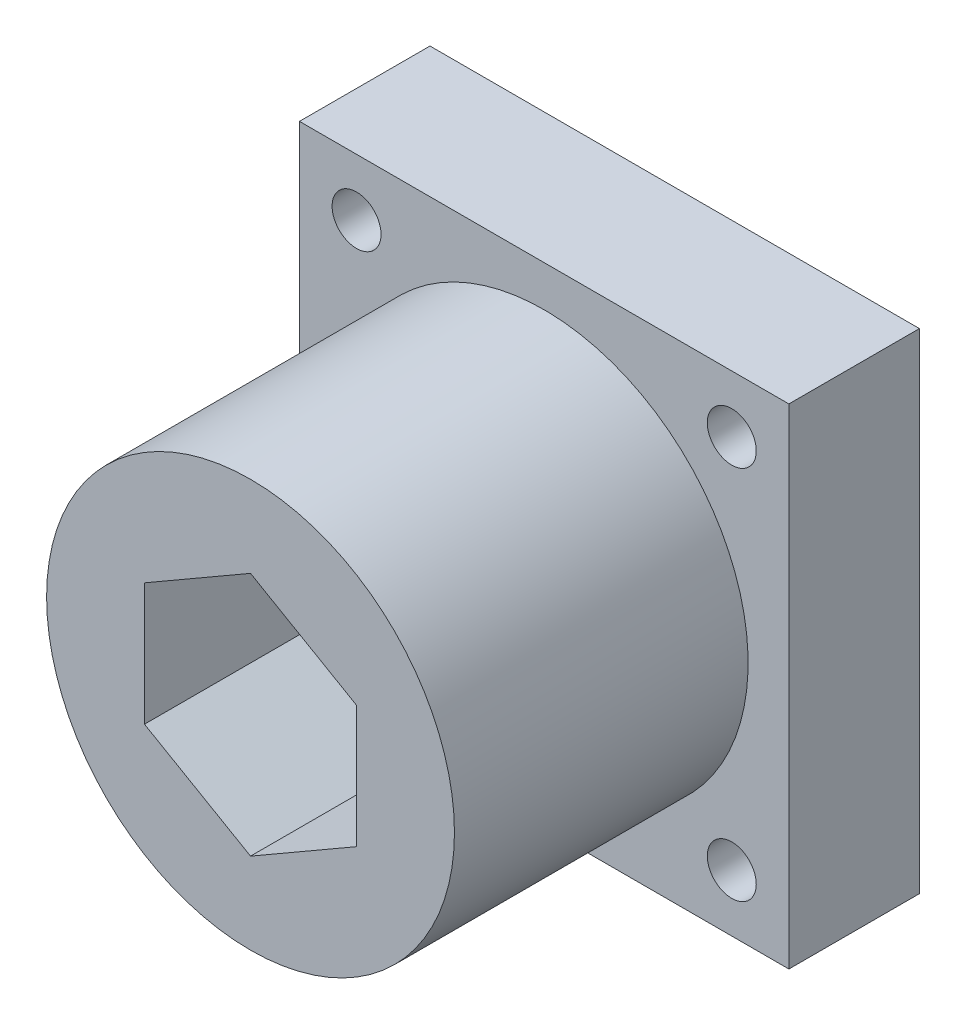
ISO-10303-21;
HEADER;
FILE_DESCRIPTION(('STEP AP214'),'2;1');
FILE_NAME('part.step','',(''),(''),'','','');
FILE_SCHEMA(('AUTOMOTIVE_DESIGN { 1 0 10303 214 1 1 1 1 }'));
ENDSEC;
DATA;
#1=APPLICATION_CONTEXT('core data for automotive mechanical design processes');
#2=APPLICATION_PROTOCOL_DEFINITION('international standard','automotive_design',2000,#1);
#3=PRODUCT_CONTEXT('',#1,'mechanical');
#4=PRODUCT('Part','Part','',(#3));
#5=PRODUCT_RELATED_PRODUCT_CATEGORY('part','',(#4));
#6=PRODUCT_DEFINITION_FORMATION('','',#4);
#7=PRODUCT_DEFINITION_CONTEXT('part definition',#1,'design');
#8=PRODUCT_DEFINITION('design','',#6,#7);
#9=PRODUCT_DEFINITION_SHAPE('','',#8);
#10=(LENGTH_UNIT() NAMED_UNIT(*) SI_UNIT(.MILLI.,.METRE.));
#11=(NAMED_UNIT(*) PLANE_ANGLE_UNIT() SI_UNIT($,.RADIAN.));
#12=(NAMED_UNIT(*) SI_UNIT($,.STERADIAN.) SOLID_ANGLE_UNIT());
#13=UNCERTAINTY_MEASURE_WITH_UNIT(LENGTH_MEASURE(1.E-05),#10,'distance_accuracy_value','');
#14=(GEOMETRIC_REPRESENTATION_CONTEXT(3) GLOBAL_UNCERTAINTY_ASSIGNED_CONTEXT((#13)) GLOBAL_UNIT_ASSIGNED_CONTEXT((#10,
#11,#12)) REPRESENTATION_CONTEXT('',''));
#15=CARTESIAN_POINT('',(0.,0.,0.));
#16=DIRECTION('',(0.,0.,1.));
#17=DIRECTION('',(1.,0.,0.));
#18=AXIS2_PLACEMENT_3D('',#15,#16,#17);
#19=CARTESIAN_POINT('',(0.,0.,8.));
#20=DIRECTION('',(0.,0.,-1.));
#21=DIRECTION('',(-1.,0.,0.));
#22=AXIS2_PLACEMENT_3D('',#19,#20,#21);
#23=PLANE('',#22);
#24=CARTESIAN_POINT('',(26.5,26.5,8.));
#25=DIRECTION('',(0.,0.,1.));
#26=DIRECTION('',(1.,0.,0.));
#27=AXIS2_PLACEMENT_3D('',#24,#25,#26);
#28=CIRCLE('',#27,1.5);
#29=CARTESIAN_POINT('',(28.,26.5,8.));
#30=VERTEX_POINT('',#29);
#31=EDGE_CURVE('E163',#30,#30,#28,.T.);
#32=ORIENTED_EDGE('',*,*,#31,.F.);
#33=EDGE_LOOP('',(#32));
#34=FACE_BOUND('',#33,.T.);
#35=CARTESIAN_POINT('',(26.5,3.5,8.));
#36=DIRECTION('',(0.,0.,1.));
#37=DIRECTION('',(1.,0.,0.));
#38=AXIS2_PLACEMENT_3D('',#35,#36,#37);
#39=CIRCLE('',#38,1.5);
#40=CARTESIAN_POINT('',(28.,3.5,8.));
#41=VERTEX_POINT('',#40);
#42=EDGE_CURVE('E169',#41,#41,#39,.T.);
#43=ORIENTED_EDGE('',*,*,#42,.F.);
#44=EDGE_LOOP('',(#43));
#45=FACE_BOUND('',#44,.T.);
#46=CARTESIAN_POINT('',(3.49999999999999,3.5,8.));
#47=DIRECTION('',(0.,0.,1.));
#48=DIRECTION('',(1.,0.,0.));
#49=AXIS2_PLACEMENT_3D('',#46,#47,#48);
#50=CIRCLE('',#49,1.5);
#51=CARTESIAN_POINT('',(4.99999999999999,3.5,8.));
#52=VERTEX_POINT('',#51);
#53=EDGE_CURVE('E158',#52,#52,#50,.T.);
#54=ORIENTED_EDGE('',*,*,#53,.F.);
#55=EDGE_LOOP('',(#54));
#56=FACE_BOUND('',#55,.T.);
#57=CARTESIAN_POINT('',(3.49999999999999,26.5,8.));
#58=DIRECTION('',(0.,0.,1.));
#59=DIRECTION('',(1.,0.,0.));
#60=AXIS2_PLACEMENT_3D('',#57,#58,#59);
#61=CIRCLE('',#60,1.5);
#62=CARTESIAN_POINT('',(4.99999999999999,26.5,8.));
#63=VERTEX_POINT('',#62);
#64=EDGE_CURVE('E162',#63,#63,#61,.T.);
#65=ORIENTED_EDGE('',*,*,#64,.F.);
#66=EDGE_LOOP('',(#65));
#67=FACE_BOUND('',#66,.T.);
#68=DIRECTION('',(0.,-1.,0.));
#69=VECTOR('',#68,1.);
#70=CARTESIAN_POINT('',(0.,0.,8.));
#71=LINE('',#70,#69);
#72=CARTESIAN_POINT('',(0.,30.,8.));
#73=VERTEX_POINT('',#72);
#74=CARTESIAN_POINT('',(0.,0.,8.));
#75=VERTEX_POINT('',#74);
#76=EDGE_CURVE('E211',#73,#75,#71,.T.);
#77=ORIENTED_EDGE('',*,*,#76,.T.);
#78=DIRECTION('',(1.,0.,0.));
#79=VECTOR('',#78,1.);
#80=CARTESIAN_POINT('',(0.,0.,8.));
#81=LINE('',#80,#79);
#82=CARTESIAN_POINT('',(30.,0.,8.));
#83=VERTEX_POINT('',#82);
#84=EDGE_CURVE('E86',#75,#83,#81,.T.);
#85=ORIENTED_EDGE('',*,*,#84,.T.);
#86=DIRECTION('',(0.,1.,0.));
#87=VECTOR('',#86,1.);
#88=CARTESIAN_POINT('',(30.,0.,8.));
#89=LINE('',#88,#87);
#90=CARTESIAN_POINT('',(30.,30.,8.));
#91=VERTEX_POINT('',#90);
#92=EDGE_CURVE('E214',#83,#91,#89,.T.);
#93=ORIENTED_EDGE('',*,*,#92,.T.);
#94=DIRECTION('',(-1.,0.,0.));
#95=VECTOR('',#94,1.);
#96=CARTESIAN_POINT('',(0.,30.,8.));
#97=LINE('',#96,#95);
#98=EDGE_CURVE('E57',#91,#73,#97,.T.);
#99=ORIENTED_EDGE('',*,*,#98,.T.);
#100=EDGE_LOOP('',(#77,#85,#93,#99));
#101=FACE_BOUND('',#100,.T.);
#102=CARTESIAN_POINT('',(15.,15.,8.));
#103=DIRECTION('',(0.,0.,-1.));
#104=DIRECTION('',(-1.,0.,0.));
#105=AXIS2_PLACEMENT_3D('',#102,#103,#104);
#106=CIRCLE('',#105,12.5);
#107=CARTESIAN_POINT('',(2.5,15.,8.));
#108=VERTEX_POINT('',#107);
#109=EDGE_CURVE('E11',#108,#108,#106,.F.);
#110=ORIENTED_EDGE('',*,*,#109,.F.);
#111=EDGE_LOOP('',(#110));
#112=FACE_BOUND('',#111,.T.);
#113=ADVANCED_FACE('F33',(#34,#45,#56,#67,#101,#112),#23,.F.);
#114=CARTESIAN_POINT('',(0.,0.,8.));
#115=DIRECTION('',(1.,0.,0.));
#116=DIRECTION('',(0.,1.,0.));
#117=AXIS2_PLACEMENT_3D('',#114,#115,#116);
#118=PLANE('',#117);
#119=DIRECTION('',(0.,-1.,0.));
#120=VECTOR('',#119,1.);
#121=CARTESIAN_POINT('',(0.,0.,0.));
#122=LINE('',#121,#120);
#123=CARTESIAN_POINT('',(0.,30.,0.));
#124=VERTEX_POINT('',#123);
#125=CARTESIAN_POINT('',(0.,0.,0.));
#126=VERTEX_POINT('',#125);
#127=EDGE_CURVE('E131',#124,#126,#122,.T.);
#128=ORIENTED_EDGE('',*,*,#127,.T.);
#129=DIRECTION('',(0.,0.,-1.));
#130=VECTOR('',#129,1.);
#131=CARTESIAN_POINT('',(0.,0.,8.));
#132=LINE('',#131,#130);
#133=EDGE_CURVE('E41',#75,#126,#132,.T.);
#134=ORIENTED_EDGE('',*,*,#133,.F.);
#135=ORIENTED_EDGE('',*,*,#76,.F.);
#136=DIRECTION('',(0.,0.,-1.));
#137=VECTOR('',#136,1.);
#138=CARTESIAN_POINT('',(0.,30.,8.));
#139=LINE('',#138,#137);
#140=EDGE_CURVE('E217',#73,#124,#139,.T.);
#141=ORIENTED_EDGE('',*,*,#140,.T.);
#142=EDGE_LOOP('',(#128,#134,#135,#141));
#143=FACE_BOUND('',#142,.T.);
#144=ADVANCED_FACE('F35',(#143),#118,.F.);
#145=CARTESIAN_POINT('',(0.,0.,8.));
#146=DIRECTION('',(0.,1.,0.));
#147=DIRECTION('',(0.,0.,1.));
#148=AXIS2_PLACEMENT_3D('',#145,#146,#147);
#149=PLANE('',#148);
#150=DIRECTION('',(1.,0.,0.));
#151=VECTOR('',#150,1.);
#152=CARTESIAN_POINT('',(0.,0.,0.));
#153=LINE('',#152,#151);
#154=CARTESIAN_POINT('',(30.,0.,0.));
#155=VERTEX_POINT('',#154);
#156=EDGE_CURVE('E220',#126,#155,#153,.T.);
#157=ORIENTED_EDGE('',*,*,#156,.T.);
#158=DIRECTION('',(0.,0.,-1.));
#159=VECTOR('',#158,1.);
#160=CARTESIAN_POINT('',(30.,0.,8.));
#161=LINE('',#160,#159);
#162=EDGE_CURVE('E228',#83,#155,#161,.T.);
#163=ORIENTED_EDGE('',*,*,#162,.F.);
#164=ORIENTED_EDGE('',*,*,#84,.F.);
#165=ORIENTED_EDGE('',*,*,#133,.T.);
#166=EDGE_LOOP('',(#157,#163,#164,#165));
#167=FACE_BOUND('',#166,.T.);
#168=ADVANCED_FACE('F231',(#167),#149,.F.);
#169=CARTESIAN_POINT('',(30.,0.,8.));
#170=DIRECTION('',(-1.,0.,0.));
#171=DIRECTION('',(0.,-1.,0.));
#172=AXIS2_PLACEMENT_3D('',#169,#170,#171);
#173=PLANE('',#172);
#174=DIRECTION('',(0.,1.,0.));
#175=VECTOR('',#174,1.);
#176=CARTESIAN_POINT('',(30.,0.,0.));
#177=LINE('',#176,#175);
#178=CARTESIAN_POINT('',(30.,30.,0.));
#179=VERTEX_POINT('',#178);
#180=EDGE_CURVE('E222',#155,#179,#177,.T.);
#181=ORIENTED_EDGE('',*,*,#180,.T.);
#182=DIRECTION('',(0.,0.,-1.));
#183=VECTOR('',#182,1.);
#184=CARTESIAN_POINT('',(30.,30.,8.));
#185=LINE('',#184,#183);
#186=EDGE_CURVE('E226',#91,#179,#185,.T.);
#187=ORIENTED_EDGE('',*,*,#186,.F.);
#188=ORIENTED_EDGE('',*,*,#92,.F.);
#189=ORIENTED_EDGE('',*,*,#162,.T.);
#190=EDGE_LOOP('',(#181,#187,#188,#189));
#191=FACE_BOUND('',#190,.T.);
#192=ADVANCED_FACE('F240',(#191),#173,.F.);
#193=CARTESIAN_POINT('',(0.,30.,8.));
#194=DIRECTION('',(0.,-1.,0.));
#195=DIRECTION('',(0.,0.,-1.));
#196=AXIS2_PLACEMENT_3D('',#193,#194,#195);
#197=PLANE('',#196);
#198=DIRECTION('',(-1.,0.,0.));
#199=VECTOR('',#198,1.);
#200=CARTESIAN_POINT('',(0.,30.,0.));
#201=LINE('',#200,#199);
#202=EDGE_CURVE('E78',#179,#124,#201,.T.);
#203=ORIENTED_EDGE('',*,*,#202,.T.);
#204=ORIENTED_EDGE('',*,*,#140,.F.);
#205=ORIENTED_EDGE('',*,*,#98,.F.);
#206=ORIENTED_EDGE('',*,*,#186,.T.);
#207=EDGE_LOOP('',(#203,#204,#205,#206));
#208=FACE_BOUND('',#207,.T.);
#209=ADVANCED_FACE('F242',(#208),#197,.F.);
#210=CARTESIAN_POINT('',(0.,0.,0.));
#211=DIRECTION('',(0.,0.,-1.));
#212=DIRECTION('',(-1.,0.,0.));
#213=AXIS2_PLACEMENT_3D('',#210,#211,#212);
#214=PLANE('',#213);
#215=CARTESIAN_POINT('',(26.5,26.5,0.));
#216=DIRECTION('',(0.,0.,1.));
#217=DIRECTION('',(1.,0.,0.));
#218=AXIS2_PLACEMENT_3D('',#215,#216,#217);
#219=CIRCLE('',#218,1.5);
#220=CARTESIAN_POINT('',(28.,26.5,0.));
#221=VERTEX_POINT('',#220);
#222=EDGE_CURVE('E159',#221,#221,#219,.T.);
#223=ORIENTED_EDGE('',*,*,#222,.T.);
#224=EDGE_LOOP('',(#223));
#225=FACE_BOUND('',#224,.T.);
#226=CARTESIAN_POINT('',(26.5,3.5,0.));
#227=DIRECTION('',(0.,0.,1.));
#228=DIRECTION('',(1.,0.,0.));
#229=AXIS2_PLACEMENT_3D('',#226,#227,#228);
#230=CIRCLE('',#229,1.5);
#231=CARTESIAN_POINT('',(28.,3.5,0.));
#232=VERTEX_POINT('',#231);
#233=EDGE_CURVE('E166',#232,#232,#230,.T.);
#234=ORIENTED_EDGE('',*,*,#233,.T.);
#235=EDGE_LOOP('',(#234));
#236=FACE_BOUND('',#235,.T.);
#237=CARTESIAN_POINT('',(3.49999999999999,3.5,0.));
#238=DIRECTION('',(0.,0.,1.));
#239=DIRECTION('',(1.,0.,0.));
#240=AXIS2_PLACEMENT_3D('',#237,#238,#239);
#241=CIRCLE('',#240,1.5);
#242=CARTESIAN_POINT('',(4.99999999999999,3.5,0.));
#243=VERTEX_POINT('',#242);
#244=EDGE_CURVE('E172',#243,#243,#241,.T.);
#245=ORIENTED_EDGE('',*,*,#244,.T.);
#246=EDGE_LOOP('',(#245));
#247=FACE_BOUND('',#246,.T.);
#248=CARTESIAN_POINT('',(3.49999999999999,26.5,0.));
#249=DIRECTION('',(0.,0.,1.));
#250=DIRECTION('',(1.,0.,0.));
#251=AXIS2_PLACEMENT_3D('',#248,#249,#250);
#252=CIRCLE('',#251,1.5);
#253=CARTESIAN_POINT('',(4.99999999999999,26.5,0.));
#254=VERTEX_POINT('',#253);
#255=EDGE_CURVE('E177',#254,#254,#252,.T.);
#256=ORIENTED_EDGE('',*,*,#255,.T.);
#257=EDGE_LOOP('',(#256));
#258=FACE_BOUND('',#257,.T.);
#259=CARTESIAN_POINT('',(15.,15.,0.));
#260=DIRECTION('',(0.,0.,1.));
#261=DIRECTION('',(1.,0.,0.));
#262=AXIS2_PLACEMENT_3D('',#259,#260,#261);
#263=CIRCLE('',#262,5.5);
#264=CARTESIAN_POINT('',(20.5,15.,0.));
#265=VERTEX_POINT('',#264);
#266=EDGE_CURVE('E183',#265,#265,#263,.T.);
#267=ORIENTED_EDGE('',*,*,#266,.T.);
#268=EDGE_LOOP('',(#267));
#269=FACE_BOUND('',#268,.T.);
#270=ORIENTED_EDGE('',*,*,#127,.F.);
#271=ORIENTED_EDGE('',*,*,#202,.F.);
#272=ORIENTED_EDGE('',*,*,#180,.F.);
#273=ORIENTED_EDGE('',*,*,#156,.F.);
#274=EDGE_LOOP('',(#270,#271,#272,#273));
#275=FACE_BOUND('',#274,.T.);
#276=ADVANCED_FACE('F236',(#225,#236,#247,#258,#269,#275),#214,.T.);
#277=CARTESIAN_POINT('',(15.,15.,16.));
#278=DIRECTION('',(0.,0.,-1.));
#279=DIRECTION('',(-1.,0.,0.));
#280=AXIS2_PLACEMENT_3D('',#277,#278,#279);
#281=CYLINDRICAL_SURFACE('',#280,12.5);
#282=ORIENTED_EDGE('',*,*,#109,.T.);
#283=EDGE_LOOP('',(#282));
#284=FACE_BOUND('',#283,.T.);
#285=CARTESIAN_POINT('',(15.,15.,26.));
#286=DIRECTION('',(0.,0.,1.));
#287=DIRECTION('',(1.,0.,0.));
#288=AXIS2_PLACEMENT_3D('',#285,#286,#287);
#289=CIRCLE('',#288,12.5);
#290=CARTESIAN_POINT('',(27.5,15.,26.));
#291=VERTEX_POINT('',#290);
#292=EDGE_CURVE('E155',#291,#291,#289,.T.);
#293=ORIENTED_EDGE('',*,*,#292,.F.);
#294=EDGE_LOOP('',(#293));
#295=FACE_BOUND('',#294,.T.);
#296=ADVANCED_FACE('F250',(#284,#295),#281,.T.);
#297=CARTESIAN_POINT('',(21.5,18.7527767497326,16.));
#298=DIRECTION('',(-0.5,-0.866025403784439,0.));
#299=DIRECTION('',(0.866025403784439,-0.5,0.));
#300=AXIS2_PLACEMENT_3D('',#297,#298,#299);
#301=PLANE('',#300);
#302=DIRECTION('',(-0.866025403784438,0.5,0.));
#303=VECTOR('',#302,1.);
#304=CARTESIAN_POINT('',(21.5,18.7527767497326,8.));
#305=LINE('',#304,#303);
#306=CARTESIAN_POINT('',(21.5,18.7527767497326,8.));
#307=VERTEX_POINT('',#306);
#308=CARTESIAN_POINT('',(15.,22.5055534994651,8.));
#309=VERTEX_POINT('',#308);
#310=EDGE_CURVE('E186',#307,#309,#305,.T.);
#311=ORIENTED_EDGE('',*,*,#310,.F.);
#312=DIRECTION('',(0.,0.,-1.));
#313=VECTOR('',#312,1.);
#314=CARTESIAN_POINT('',(21.5,18.7527767497326,16.));
#315=LINE('',#314,#313);
#316=CARTESIAN_POINT('',(21.5,18.7527767497326,26.));
#317=VERTEX_POINT('',#316);
#318=EDGE_CURVE('E48',#317,#307,#315,.T.);
#319=ORIENTED_EDGE('',*,*,#318,.F.);
#320=DIRECTION('',(-0.866025403784438,0.5,0.));
#321=VECTOR('',#320,1.);
#322=CARTESIAN_POINT('',(21.5,18.7527767497326,26.));
#323=LINE('',#322,#321);
#324=CARTESIAN_POINT('',(15.,22.5055534994651,26.));
#325=VERTEX_POINT('',#324);
#326=EDGE_CURVE('E135',#317,#325,#323,.T.);
#327=ORIENTED_EDGE('',*,*,#326,.T.);
#328=DIRECTION('',(0.,0.,-1.));
#329=VECTOR('',#328,1.);
#330=CARTESIAN_POINT('',(15.,22.5055534994651,16.));
#331=LINE('',#330,#329);
#332=EDGE_CURVE('E121',#325,#309,#331,.T.);
#333=ORIENTED_EDGE('',*,*,#332,.T.);
#334=EDGE_LOOP('',(#311,#319,#327,#333));
#335=FACE_BOUND('',#334,.T.);
#336=ADVANCED_FACE('F136',(#335),#301,.T.);
#337=CARTESIAN_POINT('',(15.,22.5055534994651,16.));
#338=DIRECTION('',(0.5,-0.866025403784439,0.));
#339=DIRECTION('',(0.866025403784439,0.5,0.));
#340=AXIS2_PLACEMENT_3D('',#337,#338,#339);
#341=PLANE('',#340);
#342=DIRECTION('',(-0.866025403784438,-0.5,0.));
#343=VECTOR('',#342,1.);
#344=CARTESIAN_POINT('',(15.,22.5055534994651,8.));
#345=LINE('',#344,#343);
#346=CARTESIAN_POINT('',(8.49999999999999,18.7527767497326,8.));
#347=VERTEX_POINT('',#346);
#348=EDGE_CURVE('E128',#309,#347,#345,.T.);
#349=ORIENTED_EDGE('',*,*,#348,.F.);
#350=ORIENTED_EDGE('',*,*,#332,.F.);
#351=DIRECTION('',(-0.866025403784439,-0.5,0.));
#352=VECTOR('',#351,1.);
#353=CARTESIAN_POINT('',(15.,22.5055534994651,26.));
#354=LINE('',#353,#352);
#355=CARTESIAN_POINT('',(8.49999999999999,18.7527767497326,26.));
#356=VERTEX_POINT('',#355);
#357=EDGE_CURVE('E125',#325,#356,#354,.T.);
#358=ORIENTED_EDGE('',*,*,#357,.T.);
#359=DIRECTION('',(0.,0.,-1.));
#360=VECTOR('',#359,1.);
#361=CARTESIAN_POINT('',(8.49999999999999,18.7527767497326,16.));
#362=LINE('',#361,#360);
#363=EDGE_CURVE('E132',#356,#347,#362,.T.);
#364=ORIENTED_EDGE('',*,*,#363,.T.);
#365=EDGE_LOOP('',(#349,#350,#358,#364));
#366=FACE_BOUND('',#365,.T.);
#367=ADVANCED_FACE('F123',(#366),#341,.T.);
#368=CARTESIAN_POINT('',(8.49999999999999,18.7527767497326,16.));
#369=DIRECTION('',(1.,0.,0.));
#370=DIRECTION('',(0.,0.,-1.));
#371=AXIS2_PLACEMENT_3D('',#368,#369,#370);
#372=PLANE('',#371);
#373=DIRECTION('',(0.,-1.,0.));
#374=VECTOR('',#373,1.);
#375=CARTESIAN_POINT('',(8.49999999999999,18.7527767497326,8.));
#376=LINE('',#375,#374);
#377=CARTESIAN_POINT('',(8.49999999999999,11.2472232502674,8.));
#378=VERTEX_POINT('',#377);
#379=EDGE_CURVE('E191',#347,#378,#376,.T.);
#380=ORIENTED_EDGE('',*,*,#379,.F.);
#381=ORIENTED_EDGE('',*,*,#363,.F.);
#382=DIRECTION('',(0.,-1.,0.));
#383=VECTOR('',#382,1.);
#384=CARTESIAN_POINT('',(8.49999999999999,18.7527767497326,26.));
#385=LINE('',#384,#383);
#386=CARTESIAN_POINT('',(8.49999999999999,11.2472232502674,26.));
#387=VERTEX_POINT('',#386);
#388=EDGE_CURVE('E143',#356,#387,#385,.T.);
#389=ORIENTED_EDGE('',*,*,#388,.T.);
#390=DIRECTION('',(0.,0.,-1.));
#391=VECTOR('',#390,1.);
#392=CARTESIAN_POINT('',(8.49999999999999,11.2472232502674,16.));
#393=LINE('',#392,#391);
#394=EDGE_CURVE('E208',#387,#378,#393,.T.);
#395=ORIENTED_EDGE('',*,*,#394,.T.);
#396=EDGE_LOOP('',(#380,#381,#389,#395));
#397=FACE_BOUND('',#396,.T.);
#398=ADVANCED_FACE('F291',(#397),#372,.T.);
#399=CARTESIAN_POINT('',(8.49999999999999,11.2472232502674,16.));
#400=DIRECTION('',(0.5,0.866025403784439,0.));
#401=DIRECTION('',(-0.866025403784439,0.5,0.));
#402=AXIS2_PLACEMENT_3D('',#399,#400,#401);
#403=PLANE('',#402);
#404=DIRECTION('',(0.866025403784439,-0.5,0.));
#405=VECTOR('',#404,1.);
#406=CARTESIAN_POINT('',(8.49999999999999,11.2472232502674,8.));
#407=LINE('',#406,#405);
#408=CARTESIAN_POINT('',(15.,7.49444650053486,8.));
#409=VERTEX_POINT('',#408);
#410=EDGE_CURVE('E194',#378,#409,#407,.T.);
#411=ORIENTED_EDGE('',*,*,#410,.F.);
#412=ORIENTED_EDGE('',*,*,#394,.F.);
#413=DIRECTION('',(0.866025403784439,-0.5,0.));
#414=VECTOR('',#413,1.);
#415=CARTESIAN_POINT('',(8.49999999999999,11.2472232502674,26.));
#416=LINE('',#415,#414);
#417=CARTESIAN_POINT('',(15.,7.49444650053486,26.));
#418=VERTEX_POINT('',#417);
#419=EDGE_CURVE('E145',#387,#418,#416,.T.);
#420=ORIENTED_EDGE('',*,*,#419,.T.);
#421=DIRECTION('',(0.,0.,-1.));
#422=VECTOR('',#421,1.);
#423=CARTESIAN_POINT('',(15.,7.49444650053486,16.));
#424=LINE('',#423,#422);
#425=EDGE_CURVE('E206',#418,#409,#424,.T.);
#426=ORIENTED_EDGE('',*,*,#425,.T.);
#427=EDGE_LOOP('',(#411,#412,#420,#426));
#428=FACE_BOUND('',#427,.T.);
#429=ADVANCED_FACE('F287',(#428),#403,.T.);
#430=CARTESIAN_POINT('',(15.,7.49444650053486,16.));
#431=DIRECTION('',(-0.5,0.866025403784439,0.));
#432=DIRECTION('',(-0.866025403784439,-0.5,0.));
#433=AXIS2_PLACEMENT_3D('',#430,#431,#432);
#434=PLANE('',#433);
#435=DIRECTION('',(0.866025403784439,0.5,0.));
#436=VECTOR('',#435,1.);
#437=CARTESIAN_POINT('',(15.,7.49444650053486,8.));
#438=LINE('',#437,#436);
#439=CARTESIAN_POINT('',(21.5,11.2472232502674,8.));
#440=VERTEX_POINT('',#439);
#441=EDGE_CURVE('E197',#409,#440,#438,.T.);
#442=ORIENTED_EDGE('',*,*,#441,.F.);
#443=ORIENTED_EDGE('',*,*,#425,.F.);
#444=DIRECTION('',(0.866025403784439,0.5,0.));
#445=VECTOR('',#444,1.);
#446=CARTESIAN_POINT('',(15.,7.49444650053486,26.));
#447=LINE('',#446,#445);
#448=CARTESIAN_POINT('',(21.5,11.2472232502674,26.));
#449=VERTEX_POINT('',#448);
#450=EDGE_CURVE('E150',#418,#449,#447,.T.);
#451=ORIENTED_EDGE('',*,*,#450,.T.);
#452=DIRECTION('',(0.,0.,-1.));
#453=VECTOR('',#452,1.);
#454=CARTESIAN_POINT('',(21.5,11.2472232502674,16.));
#455=LINE('',#454,#453);
#456=EDGE_CURVE('E204',#449,#440,#455,.T.);
#457=ORIENTED_EDGE('',*,*,#456,.T.);
#458=EDGE_LOOP('',(#442,#443,#451,#457));
#459=FACE_BOUND('',#458,.T.);
#460=ADVANCED_FACE('F284',(#459),#434,.T.);
#461=CARTESIAN_POINT('',(21.5,11.2472232502674,16.));
#462=DIRECTION('',(-1.,0.,0.));
#463=DIRECTION('',(0.,0.,1.));
#464=AXIS2_PLACEMENT_3D('',#461,#462,#463);
#465=PLANE('',#464);
#466=DIRECTION('',(0.,1.,0.));
#467=VECTOR('',#466,1.);
#468=CARTESIAN_POINT('',(21.5,11.2472232502674,8.));
#469=LINE('',#468,#467);
#470=EDGE_CURVE('E200',#440,#307,#469,.T.);
#471=ORIENTED_EDGE('',*,*,#470,.F.);
#472=ORIENTED_EDGE('',*,*,#456,.F.);
#473=DIRECTION('',(0.,1.,0.));
#474=VECTOR('',#473,1.);
#475=CARTESIAN_POINT('',(21.5,11.2472232502674,26.));
#476=LINE('',#475,#474);
#477=EDGE_CURVE('E153',#449,#317,#476,.T.);
#478=ORIENTED_EDGE('',*,*,#477,.T.);
#479=ORIENTED_EDGE('',*,*,#318,.T.);
#480=EDGE_LOOP('',(#471,#472,#478,#479));
#481=FACE_BOUND('',#480,.T.);
#482=ADVANCED_FACE('F281',(#481),#465,.T.);
#483=CARTESIAN_POINT('',(15.,15.,8.));
#484=DIRECTION('',(0.,0.,1.));
#485=DIRECTION('',(1.,0.,0.));
#486=AXIS2_PLACEMENT_3D('',#483,#484,#485);
#487=CIRCLE('',#486,5.5);
#488=CARTESIAN_POINT('',(20.5,15.,8.));
#489=VERTEX_POINT('',#488);
#490=EDGE_CURVE('E180',#489,#489,#487,.T.);
#491=ORIENTED_EDGE('',*,*,#490,.F.);
#492=EDGE_LOOP('',(#491));
#493=FACE_BOUND('',#492,.T.);
#494=ORIENTED_EDGE('',*,*,#470,.T.);
#495=ORIENTED_EDGE('',*,*,#310,.T.);
#496=ORIENTED_EDGE('',*,*,#348,.T.);
#497=ORIENTED_EDGE('',*,*,#379,.T.);
#498=ORIENTED_EDGE('',*,*,#410,.T.);
#499=ORIENTED_EDGE('',*,*,#441,.T.);
#500=EDGE_LOOP('',(#494,#495,#496,#497,#498,#499));
#501=FACE_BOUND('',#500,.T.);
#502=ADVANCED_FACE('F247',(#493,#501),#23,.F.);
#503=CARTESIAN_POINT('',(15.,15.,0.));
#504=DIRECTION('',(0.,0.,1.));
#505=DIRECTION('',(1.,0.,0.));
#506=AXIS2_PLACEMENT_3D('',#503,#504,#505);
#507=CYLINDRICAL_SURFACE('',#506,5.5);
#508=ORIENTED_EDGE('',*,*,#266,.F.);
#509=EDGE_LOOP('',(#508));
#510=FACE_BOUND('',#509,.T.);
#511=ORIENTED_EDGE('',*,*,#490,.T.);
#512=EDGE_LOOP('',(#511));
#513=FACE_BOUND('',#512,.T.);
#514=ADVANCED_FACE('F276',(#510,#513),#507,.F.);
#515=CARTESIAN_POINT('',(3.49999999999999,26.5,0.));
#516=DIRECTION('',(0.,0.,1.));
#517=DIRECTION('',(1.,0.,0.));
#518=AXIS2_PLACEMENT_3D('',#515,#516,#517);
#519=CYLINDRICAL_SURFACE('',#518,1.5);
#520=ORIENTED_EDGE('',*,*,#255,.F.);
#521=EDGE_LOOP('',(#520));
#522=FACE_BOUND('',#521,.T.);
#523=ORIENTED_EDGE('',*,*,#64,.T.);
#524=EDGE_LOOP('',(#523));
#525=FACE_BOUND('',#524,.T.);
#526=ADVANCED_FACE('F272',(#522,#525),#519,.F.);
#527=CARTESIAN_POINT('',(3.49999999999999,3.5,0.));
#528=DIRECTION('',(0.,0.,1.));
#529=DIRECTION('',(1.,0.,0.));
#530=AXIS2_PLACEMENT_3D('',#527,#528,#529);
#531=CYLINDRICAL_SURFACE('',#530,1.5);
#532=ORIENTED_EDGE('',*,*,#244,.F.);
#533=EDGE_LOOP('',(#532));
#534=FACE_BOUND('',#533,.T.);
#535=ORIENTED_EDGE('',*,*,#53,.T.);
#536=EDGE_LOOP('',(#535));
#537=FACE_BOUND('',#536,.T.);
#538=ADVANCED_FACE('F268',(#534,#537),#531,.F.);
#539=CARTESIAN_POINT('',(26.5,3.5,0.));
#540=DIRECTION('',(0.,0.,1.));
#541=DIRECTION('',(1.,0.,0.));
#542=AXIS2_PLACEMENT_3D('',#539,#540,#541);
#543=CYLINDRICAL_SURFACE('',#542,1.5);
#544=ORIENTED_EDGE('',*,*,#233,.F.);
#545=EDGE_LOOP('',(#544));
#546=FACE_BOUND('',#545,.T.);
#547=ORIENTED_EDGE('',*,*,#42,.T.);
#548=EDGE_LOOP('',(#547));
#549=FACE_BOUND('',#548,.T.);
#550=ADVANCED_FACE('F262',(#546,#549),#543,.F.);
#551=CARTESIAN_POINT('',(26.5,26.5,0.));
#552=DIRECTION('',(0.,0.,1.));
#553=DIRECTION('',(1.,0.,0.));
#554=AXIS2_PLACEMENT_3D('',#551,#552,#553);
#555=CYLINDRICAL_SURFACE('',#554,1.5);
#556=ORIENTED_EDGE('',*,*,#222,.F.);
#557=EDGE_LOOP('',(#556));
#558=FACE_BOUND('',#557,.T.);
#559=ORIENTED_EDGE('',*,*,#31,.T.);
#560=EDGE_LOOP('',(#559));
#561=FACE_BOUND('',#560,.T.);
#562=ADVANCED_FACE('F257',(#558,#561),#555,.F.);
#563=CARTESIAN_POINT('',(15.,15.,26.));
#564=DIRECTION('',(0.,0.,1.));
#565=DIRECTION('',(1.,0.,0.));
#566=AXIS2_PLACEMENT_3D('',#563,#564,#565);
#567=PLANE('',#566);
#568=ORIENTED_EDGE('',*,*,#292,.T.);
#569=EDGE_LOOP('',(#568));
#570=FACE_BOUND('',#569,.T.);
#571=ORIENTED_EDGE('',*,*,#357,.F.);
#572=ORIENTED_EDGE('',*,*,#326,.F.);
#573=ORIENTED_EDGE('',*,*,#477,.F.);
#574=ORIENTED_EDGE('',*,*,#450,.F.);
#575=ORIENTED_EDGE('',*,*,#419,.F.);
#576=ORIENTED_EDGE('',*,*,#388,.F.);
#577=EDGE_LOOP('',(#571,#572,#573,#574,#575,#576));
#578=FACE_BOUND('',#577,.T.);
#579=ADVANCED_FACE('F140',(#570,#578),#567,.T.);
#580=CLOSED_SHELL('',(#113,#144,#168,#192,#209,#276,#296,#336,#367,#398,#429,#460,#482,#502,
#514,#526,#538,#550,#562,#579));
#581=MANIFOLD_SOLID_BREP('B2',#580);
#582=ADVANCED_BREP_SHAPE_REPRESENTATION('',(#18,#581),#14);
#583=SHAPE_DEFINITION_REPRESENTATION(#9,#582);
ENDSEC;
END-ISO-10303-21;
